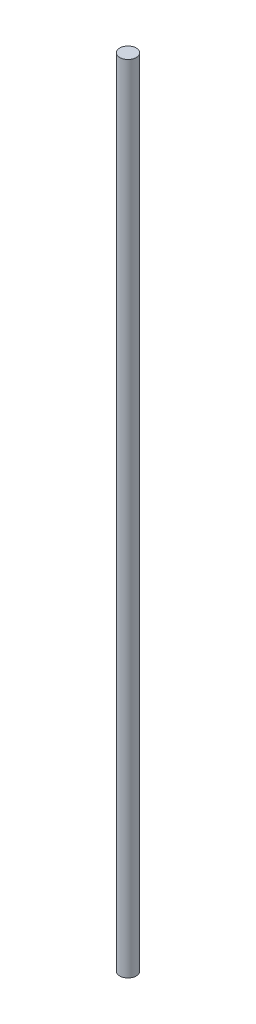
ISO-10303-21;
HEADER;
FILE_DESCRIPTION(('STEP AP214'),'2;1');
FILE_NAME('part.step','',(''),(''),'','','');
FILE_SCHEMA(('AUTOMOTIVE_DESIGN { 1 0 10303 214 1 1 1 1 }'));
ENDSEC;
DATA;
#1=APPLICATION_CONTEXT('core data for automotive mechanical design processes');
#2=APPLICATION_PROTOCOL_DEFINITION('international standard','automotive_design',2000,#1);
#3=PRODUCT_CONTEXT('',#1,'mechanical');
#4=PRODUCT('Part','Part','',(#3));
#5=PRODUCT_RELATED_PRODUCT_CATEGORY('part','',(#4));
#6=PRODUCT_DEFINITION_FORMATION('','',#4);
#7=PRODUCT_DEFINITION_CONTEXT('part definition',#1,'design');
#8=PRODUCT_DEFINITION('design','',#6,#7);
#9=PRODUCT_DEFINITION_SHAPE('','',#8);
#10=(LENGTH_UNIT() NAMED_UNIT(*) SI_UNIT(.MILLI.,.METRE.));
#11=(NAMED_UNIT(*) PLANE_ANGLE_UNIT() SI_UNIT($,.RADIAN.));
#12=(NAMED_UNIT(*) SI_UNIT($,.STERADIAN.) SOLID_ANGLE_UNIT());
#13=UNCERTAINTY_MEASURE_WITH_UNIT(LENGTH_MEASURE(1.E-05),#10,'distance_accuracy_value','');
#14=(GEOMETRIC_REPRESENTATION_CONTEXT(3) GLOBAL_UNCERTAINTY_ASSIGNED_CONTEXT((#13)) GLOBAL_UNIT_ASSIGNED_CONTEXT((#10,
#11,#12)) REPRESENTATION_CONTEXT('',''));
#15=CARTESIAN_POINT('',(0.,0.,0.));
#16=DIRECTION('',(0.,0.,1.));
#17=DIRECTION('',(1.,0.,0.));
#18=AXIS2_PLACEMENT_3D('',#15,#16,#17);
#19=CARTESIAN_POINT('',(0.,305.562,0.));
#20=DIRECTION('',(0.,-1.,0.));
#21=DIRECTION('',(0.,0.,-1.));
#22=AXIS2_PLACEMENT_3D('',#19,#20,#21);
#23=CYLINDRICAL_SURFACE('',#22,3.175);
#24=CARTESIAN_POINT('',(0.,305.562,0.));
#25=DIRECTION('',(0.,1.,0.));
#26=DIRECTION('',(0.,0.,1.));
#27=AXIS2_PLACEMENT_3D('',#24,#25,#26);
#28=CIRCLE('',#27,3.175);
#29=CARTESIAN_POINT('',(0.,305.562,3.175));
#30=VERTEX_POINT('',#29);
#31=EDGE_CURVE('E10',#30,#30,#28,.T.);
#32=ORIENTED_EDGE('',*,*,#31,.F.);
#33=EDGE_LOOP('',(#32));
#34=FACE_BOUND('',#33,.T.);
#35=CARTESIAN_POINT('',(0.,0.,0.));
#36=DIRECTION('',(0.,1.,0.));
#37=DIRECTION('',(0.,0.,1.));
#38=AXIS2_PLACEMENT_3D('',#35,#36,#37);
#39=CIRCLE('',#38,3.175);
#40=CARTESIAN_POINT('',(0.,0.,3.175));
#41=VERTEX_POINT('',#40);
#42=EDGE_CURVE('E40',#41,#41,#39,.T.);
#43=ORIENTED_EDGE('',*,*,#42,.T.);
#44=EDGE_LOOP('',(#43));
#45=FACE_BOUND('',#44,.T.);
#46=ADVANCED_FACE('F37',(#34,#45),#23,.T.);
#47=CARTESIAN_POINT('',(0.,305.562,0.));
#48=DIRECTION('',(0.,1.,0.));
#49=DIRECTION('',(0.,0.,1.));
#50=AXIS2_PLACEMENT_3D('',#47,#48,#49);
#51=PLANE('',#50);
#52=ORIENTED_EDGE('',*,*,#31,.T.);
#53=EDGE_LOOP('',(#52));
#54=FACE_BOUND('',#53,.T.);
#55=ADVANCED_FACE('F54',(#54),#51,.T.);
#56=CARTESIAN_POINT('',(0.,0.,0.));
#57=DIRECTION('',(0.,1.,0.));
#58=DIRECTION('',(0.,0.,1.));
#59=AXIS2_PLACEMENT_3D('',#56,#57,#58);
#60=PLANE('',#59);
#61=ORIENTED_EDGE('',*,*,#42,.F.);
#62=EDGE_LOOP('',(#61));
#63=FACE_BOUND('',#62,.T.);
#64=ADVANCED_FACE('F52',(#63),#60,.F.);
#65=CLOSED_SHELL('',(#46,#55,#64));
#66=MANIFOLD_SOLID_BREP('B2',#65);
#67=ADVANCED_BREP_SHAPE_REPRESENTATION('',(#18,#66),#14);
#68=SHAPE_DEFINITION_REPRESENTATION(#9,#67);
ENDSEC;
END-ISO-10303-21;
